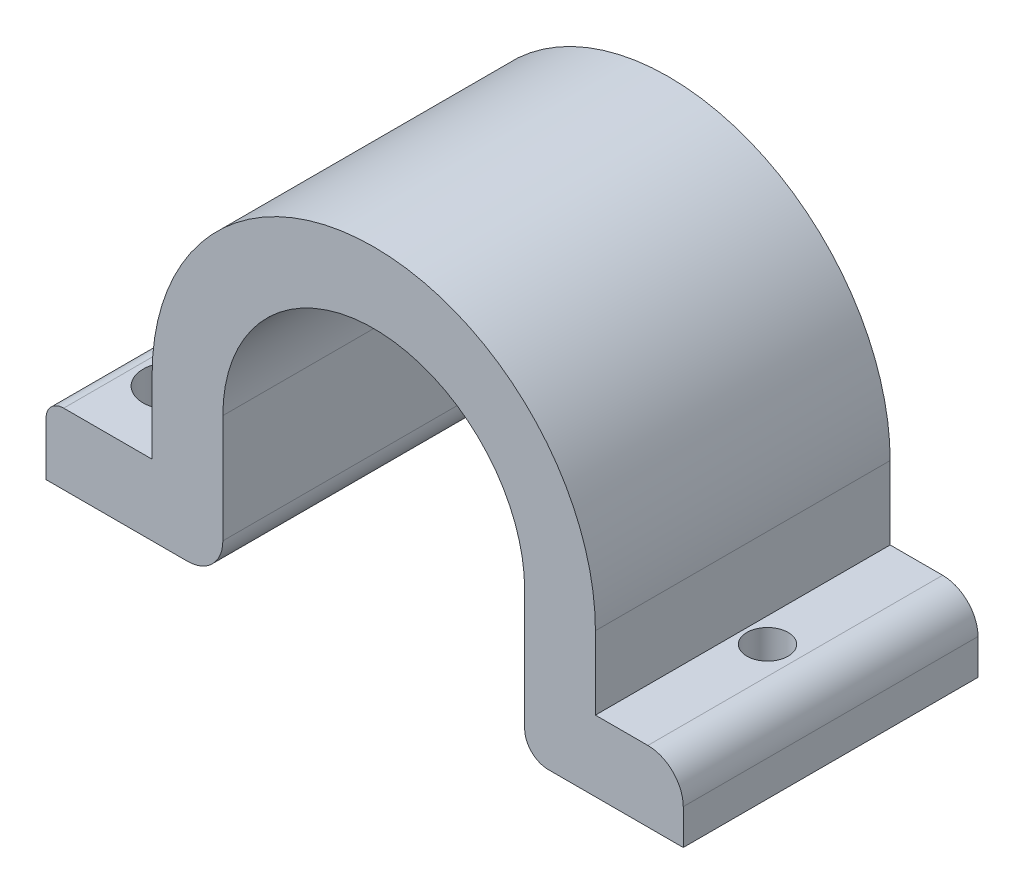
ISO-10303-21;
HEADER;
FILE_DESCRIPTION(('STEP AP214'),'2;1');
FILE_NAME('part.step','',(''),(''),'','','');
FILE_SCHEMA(('AUTOMOTIVE_DESIGN { 1 0 10303 214 1 1 1 1 }'));
ENDSEC;
DATA;
#1=APPLICATION_CONTEXT('core data for automotive mechanical design processes');
#2=APPLICATION_PROTOCOL_DEFINITION('international standard','automotive_design',2000,#1);
#3=PRODUCT_CONTEXT('',#1,'mechanical');
#4=PRODUCT('Part','Part','',(#3));
#5=PRODUCT_RELATED_PRODUCT_CATEGORY('part','',(#4));
#6=PRODUCT_DEFINITION_FORMATION('','',#4);
#7=PRODUCT_DEFINITION_CONTEXT('part definition',#1,'design');
#8=PRODUCT_DEFINITION('design','',#6,#7);
#9=PRODUCT_DEFINITION_SHAPE('','',#8);
#10=(LENGTH_UNIT() NAMED_UNIT(*) SI_UNIT(.MILLI.,.METRE.));
#11=(NAMED_UNIT(*) PLANE_ANGLE_UNIT() SI_UNIT($,.RADIAN.));
#12=(NAMED_UNIT(*) SI_UNIT($,.STERADIAN.) SOLID_ANGLE_UNIT());
#13=UNCERTAINTY_MEASURE_WITH_UNIT(LENGTH_MEASURE(1.E-05),#10,'distance_accuracy_value','');
#14=(GEOMETRIC_REPRESENTATION_CONTEXT(3) GLOBAL_UNCERTAINTY_ASSIGNED_CONTEXT((#13)) GLOBAL_UNIT_ASSIGNED_CONTEXT((#10,
#11,#12)) REPRESENTATION_CONTEXT('',''));
#15=CARTESIAN_POINT('',(0.,0.,0.));
#16=DIRECTION('',(0.,0.,1.));
#17=DIRECTION('',(1.,0.,0.));
#18=AXIS2_PLACEMENT_3D('',#15,#16,#17);
#19=CARTESIAN_POINT('',(0.397051683197472,57.076719781537,12.5));
#20=DIRECTION('',(0.,1.,0.));
#21=DIRECTION('',(-1.,0.,0.));
#22=AXIS2_PLACEMENT_3D('',#19,#20,#21);
#23=PLANE('',#22);
#24=DIRECTION('',(1.,0.,0.));
#25=VECTOR('',#24,1.);
#26=CARTESIAN_POINT('',(0.397051683197472,57.076719781537,-12.5));
#27=LINE('',#26,#25);
#28=CARTESIAN_POINT('',(-1.60294831680253,57.076719781537,-12.5));
#29=VERTEX_POINT('',#28);
#30=CARTESIAN_POINT('',(10.3970516831975,57.076719781537,-12.5));
#31=VERTEX_POINT('',#30);
#32=EDGE_CURVE('E165',#29,#31,#27,.T.);
#33=ORIENTED_EDGE('',*,*,#32,.T.);
#34=DIRECTION('',(0.,0.,-1.));
#35=VECTOR('',#34,1.);
#36=CARTESIAN_POINT('',(10.3970516831975,57.076719781537,12.5));
#37=LINE('',#36,#35);
#38=CARTESIAN_POINT('',(10.3970516831975,57.076719781537,12.5));
#39=VERTEX_POINT('',#38);
#40=EDGE_CURVE('E162',#39,#31,#37,.T.);
#41=ORIENTED_EDGE('',*,*,#40,.F.);
#42=DIRECTION('',(1.,0.,0.));
#43=VECTOR('',#42,1.);
#44=CARTESIAN_POINT('',(0.397051683197472,57.076719781537,12.5));
#45=LINE('',#44,#43);
#46=CARTESIAN_POINT('',(-1.60294831680253,57.076719781537,12.5));
#47=VERTEX_POINT('',#46);
#48=EDGE_CURVE('E148',#47,#39,#45,.T.);
#49=ORIENTED_EDGE('',*,*,#48,.F.);
#50=DIRECTION('',(0.,0.,-1.));
#51=VECTOR('',#50,1.);
#52=CARTESIAN_POINT('',(-1.60294831680253,57.076719781537,12.5));
#53=LINE('',#52,#51);
#54=EDGE_CURVE('E201',#47,#29,#53,.T.);
#55=ORIENTED_EDGE('',*,*,#54,.T.);
#56=EDGE_LOOP('',(#33,#41,#49,#55));
#57=FACE_BOUND('',#56,.T.);
#58=CARTESIAN_POINT('',(2.89705168319747,57.076719781537,6.25));
#59=DIRECTION('',(0.,1.,0.));
#60=DIRECTION('',(-1.,0.,0.));
#61=AXIS2_PLACEMENT_3D('',#58,#59,#60);
#62=CIRCLE('',#61,2.5);
#63=CARTESIAN_POINT('',(0.397051683197472,57.076719781537,6.25));
#64=VERTEX_POINT('',#63);
#65=EDGE_CURVE('E394',#64,#64,#62,.F.);
#66=ORIENTED_EDGE('',*,*,#65,.F.);
#67=EDGE_LOOP('',(#66));
#68=FACE_BOUND('',#67,.T.);
#69=CARTESIAN_POINT('',(2.89705168319747,57.076719781537,-6.25));
#70=DIRECTION('',(0.,1.,0.));
#71=DIRECTION('',(-1.,0.,0.));
#72=AXIS2_PLACEMENT_3D('',#69,#70,#71);
#73=CIRCLE('',#72,2.5);
#74=CARTESIAN_POINT('',(0.397051683197472,57.076719781537,-6.25));
#75=VERTEX_POINT('',#74);
#76=EDGE_CURVE('E392',#75,#75,#73,.T.);
#77=ORIENTED_EDGE('',*,*,#76,.T.);
#78=EDGE_LOOP('',(#77));
#79=FACE_BOUND('',#78,.T.);
#80=ADVANCED_FACE('F37',(#57,#68,#79),#23,.F.);
#81=CARTESIAN_POINT('',(0.397051683197472,63.076719781537,12.5));
#82=DIRECTION('',(0.,-1.,0.));
#83=DIRECTION('',(1.,0.,0.));
#84=AXIS2_PLACEMENT_3D('',#81,#82,#83);
#85=PLANE('',#84);
#86=DIRECTION('',(-1.,0.,0.));
#87=VECTOR('',#86,1.);
#88=CARTESIAN_POINT('',(0.397051683197472,63.076719781537,-12.5));
#89=LINE('',#88,#87);
#90=CARTESIAN_POINT('',(7.39705168319747,63.076719781537,-12.5));
#91=VERTEX_POINT('',#90);
#92=CARTESIAN_POINT('',(-0.102948316802517,63.076719781537,-12.5));
#93=VERTEX_POINT('',#92);
#94=EDGE_CURVE('E229',#91,#93,#89,.T.);
#95=ORIENTED_EDGE('',*,*,#94,.T.);
#96=DIRECTION('',(0.,0.,-1.));
#97=VECTOR('',#96,1.);
#98=CARTESIAN_POINT('',(-0.102948316802517,63.076719781537,12.5));
#99=LINE('',#98,#97);
#100=CARTESIAN_POINT('',(-0.102948316802517,63.076719781537,12.5));
#101=VERTEX_POINT('',#100);
#102=EDGE_CURVE('E45',#93,#101,#99,.F.);
#103=ORIENTED_EDGE('',*,*,#102,.T.);
#104=DIRECTION('',(-1.,0.,0.));
#105=VECTOR('',#104,1.);
#106=CARTESIAN_POINT('',(0.397051683197472,63.076719781537,12.5));
#107=LINE('',#106,#105);
#108=CARTESIAN_POINT('',(7.39705168319747,63.076719781537,12.5));
#109=VERTEX_POINT('',#108);
#110=EDGE_CURVE('E198',#109,#101,#107,.T.);
#111=ORIENTED_EDGE('',*,*,#110,.F.);
#112=DIRECTION('',(0.,0.,-1.));
#113=VECTOR('',#112,1.);
#114=CARTESIAN_POINT('',(7.39705168319747,63.076719781537,12.5));
#115=LINE('',#114,#113);
#116=EDGE_CURVE('E233',#109,#91,#115,.T.);
#117=ORIENTED_EDGE('',*,*,#116,.T.);
#118=EDGE_LOOP('',(#95,#103,#111,#117));
#119=FACE_BOUND('',#118,.T.);
#120=CARTESIAN_POINT('',(2.89705168319747,63.076719781537,6.25));
#121=DIRECTION('',(0.,-1.,0.));
#122=DIRECTION('',(0.,0.,-1.));
#123=AXIS2_PLACEMENT_3D('',#120,#121,#122);
#124=CIRCLE('',#123,2.5);
#125=CARTESIAN_POINT('',(2.89705168319747,63.076719781537,3.75));
#126=VERTEX_POINT('',#125);
#127=EDGE_CURVE('E403',#126,#126,#124,.T.);
#128=ORIENTED_EDGE('',*,*,#127,.T.);
#129=EDGE_LOOP('',(#128));
#130=FACE_BOUND('',#129,.T.);
#131=CARTESIAN_POINT('',(2.89705168319747,63.076719781537,-6.25));
#132=DIRECTION('',(0.,1.,0.));
#133=DIRECTION('',(0.,0.,1.));
#134=AXIS2_PLACEMENT_3D('',#131,#132,#133);
#135=CIRCLE('',#134,2.5);
#136=CARTESIAN_POINT('',(2.89705168319747,63.076719781537,-3.75));
#137=VERTEX_POINT('',#136);
#138=EDGE_CURVE('E389',#137,#137,#135,.T.);
#139=ORIENTED_EDGE('',*,*,#138,.F.);
#140=EDGE_LOOP('',(#139));
#141=FACE_BOUND('',#140,.T.);
#142=ADVANCED_FACE('F330',(#119,#130,#141),#85,.F.);
#143=CARTESIAN_POINT('',(10.3970516831975,60.076719781537,12.5));
#144=DIRECTION('',(0.,0.,-1.));
#145=DIRECTION('',(-1.,0.,0.));
#146=AXIS2_PLACEMENT_3D('',#143,#144,#145);
#147=CYLINDRICAL_SURFACE('',#146,3.00000000000001);
#148=CARTESIAN_POINT('',(10.3970516831975,60.076719781537,-12.5));
#149=DIRECTION('',(0.,0.,1.));
#150=DIRECTION('',(1.,0.,0.));
#151=AXIS2_PLACEMENT_3D('',#148,#149,#150);
#152=CIRCLE('',#151,3.00000000000001);
#153=CARTESIAN_POINT('',(13.3970516831975,60.076719781537,-12.5));
#154=VERTEX_POINT('',#153);
#155=EDGE_CURVE('E203',#31,#154,#152,.T.);
#156=ORIENTED_EDGE('',*,*,#155,.T.);
#157=DIRECTION('',(0.,0.,-1.));
#158=VECTOR('',#157,1.);
#159=CARTESIAN_POINT('',(13.3970516831975,60.076719781537,12.5));
#160=LINE('',#159,#158);
#161=CARTESIAN_POINT('',(13.3970516831975,60.076719781537,12.5));
#162=VERTEX_POINT('',#161);
#163=EDGE_CURVE('E169',#162,#154,#160,.T.);
#164=ORIENTED_EDGE('',*,*,#163,.F.);
#165=CARTESIAN_POINT('',(10.3970516831975,60.076719781537,12.5));
#166=DIRECTION('',(0.,0.,1.));
#167=DIRECTION('',(1.,0.,0.));
#168=AXIS2_PLACEMENT_3D('',#165,#166,#167);
#169=CIRCLE('',#168,3.00000000000001);
#170=EDGE_CURVE('E152',#39,#162,#169,.T.);
#171=ORIENTED_EDGE('',*,*,#170,.F.);
#172=ORIENTED_EDGE('',*,*,#40,.T.);
#173=EDGE_LOOP('',(#156,#164,#171,#172));
#174=FACE_BOUND('',#173,.T.);
#175=ADVANCED_FACE('F171',(#174),#147,.T.);
#176=CARTESIAN_POINT('',(13.3970516831975,60.076719781537,12.5));
#177=DIRECTION('',(-1.,0.,0.));
#178=DIRECTION('',(0.,0.,1.));
#179=AXIS2_PLACEMENT_3D('',#176,#177,#178);
#180=PLANE('',#179);
#181=DIRECTION('',(0.,1.,0.));
#182=VECTOR('',#181,1.);
#183=CARTESIAN_POINT('',(13.3970516831975,60.076719781537,-12.5));
#184=LINE('',#183,#182);
#185=CARTESIAN_POINT('',(13.3970516831975,69.276719781537,-12.5));
#186=VERTEX_POINT('',#185);
#187=EDGE_CURVE('E206',#154,#186,#184,.T.);
#188=ORIENTED_EDGE('',*,*,#187,.T.);
#189=DIRECTION('',(0.,0.,-1.));
#190=VECTOR('',#189,1.);
#191=CARTESIAN_POINT('',(13.3970516831975,69.276719781537,12.5));
#192=LINE('',#191,#190);
#193=CARTESIAN_POINT('',(13.3970516831975,69.276719781537,12.5));
#194=VERTEX_POINT('',#193);
#195=EDGE_CURVE('E257',#194,#186,#192,.T.);
#196=ORIENTED_EDGE('',*,*,#195,.F.);
#197=DIRECTION('',(0.,1.,0.));
#198=VECTOR('',#197,1.);
#199=CARTESIAN_POINT('',(13.3970516831975,60.076719781537,12.5));
#200=LINE('',#199,#198);
#201=EDGE_CURVE('E174',#162,#194,#200,.T.);
#202=ORIENTED_EDGE('',*,*,#201,.F.);
#203=ORIENTED_EDGE('',*,*,#163,.T.);
#204=EDGE_LOOP('',(#188,#196,#202,#203));
#205=FACE_BOUND('',#204,.T.);
#206=ADVANCED_FACE('F281',(#205),#180,.F.);
#207=CARTESIAN_POINT('',(26.1970516831975,69.276719781537,12.5));
#208=DIRECTION('',(0.,0.,-1.));
#209=DIRECTION('',(-1.,0.,0.));
#210=AXIS2_PLACEMENT_3D('',#207,#208,#209);
#211=CYLINDRICAL_SURFACE('',#210,12.8);
#212=CARTESIAN_POINT('',(26.1970516831975,69.276719781537,-12.5));
#213=DIRECTION('',(0.,0.,-1.));
#214=DIRECTION('',(-1.,0.,0.));
#215=AXIS2_PLACEMENT_3D('',#212,#213,#214);
#216=CIRCLE('',#215,12.8);
#217=CARTESIAN_POINT('',(38.9970516831975,69.276719781537,-12.5));
#218=VERTEX_POINT('',#217);
#219=EDGE_CURVE('E208',#186,#218,#216,.T.);
#220=ORIENTED_EDGE('',*,*,#219,.T.);
#221=DIRECTION('',(0.,0.,-1.));
#222=VECTOR('',#221,1.);
#223=CARTESIAN_POINT('',(38.9970516831975,69.276719781537,12.5));
#224=LINE('',#223,#222);
#225=CARTESIAN_POINT('',(38.9970516831975,69.276719781537,12.5));
#226=VERTEX_POINT('',#225);
#227=EDGE_CURVE('E254',#226,#218,#224,.T.);
#228=ORIENTED_EDGE('',*,*,#227,.F.);
#229=CARTESIAN_POINT('',(26.1970516831975,69.276719781537,12.5));
#230=DIRECTION('',(0.,0.,-1.));
#231=DIRECTION('',(-1.,0.,0.));
#232=AXIS2_PLACEMENT_3D('',#229,#230,#231);
#233=CIRCLE('',#232,12.8);
#234=EDGE_CURVE('E176',#194,#226,#233,.T.);
#235=ORIENTED_EDGE('',*,*,#234,.F.);
#236=ORIENTED_EDGE('',*,*,#195,.T.);
#237=EDGE_LOOP('',(#220,#228,#235,#236));
#238=FACE_BOUND('',#237,.T.);
#239=ADVANCED_FACE('F288',(#238),#211,.F.);
#240=CARTESIAN_POINT('',(38.9970516831975,69.276719781537,12.5));
#241=DIRECTION('',(1.,0.,0.));
#242=DIRECTION('',(0.,1.,0.));
#243=AXIS2_PLACEMENT_3D('',#240,#241,#242);
#244=PLANE('',#243);
#245=DIRECTION('',(0.,-1.,0.));
#246=VECTOR('',#245,1.);
#247=CARTESIAN_POINT('',(38.9970516831975,69.276719781537,-12.5));
#248=LINE('',#247,#246);
#249=CARTESIAN_POINT('',(38.9970516831975,59.076719781537,-12.5));
#250=VERTEX_POINT('',#249);
#251=EDGE_CURVE('E210',#218,#250,#248,.T.);
#252=ORIENTED_EDGE('',*,*,#251,.T.);
#253=DIRECTION('',(0.,0.,-1.));
#254=VECTOR('',#253,1.);
#255=CARTESIAN_POINT('',(38.9970516831975,59.076719781537,12.5));
#256=LINE('',#255,#254);
#257=CARTESIAN_POINT('',(38.9970516831975,59.076719781537,12.5));
#258=VERTEX_POINT('',#257);
#259=EDGE_CURVE('E251',#258,#250,#256,.T.);
#260=ORIENTED_EDGE('',*,*,#259,.F.);
#261=DIRECTION('',(0.,-1.,0.));
#262=VECTOR('',#261,1.);
#263=CARTESIAN_POINT('',(38.9970516831975,69.276719781537,12.5));
#264=LINE('',#263,#262);
#265=EDGE_CURVE('E181',#226,#258,#264,.T.);
#266=ORIENTED_EDGE('',*,*,#265,.F.);
#267=ORIENTED_EDGE('',*,*,#227,.T.);
#268=EDGE_LOOP('',(#252,#260,#266,#267));
#269=FACE_BOUND('',#268,.T.);
#270=ADVANCED_FACE('F291',(#269),#244,.F.);
#271=CARTESIAN_POINT('',(40.9970516831975,59.076719781537,12.5));
#272=DIRECTION('',(0.,0.,-1.));
#273=DIRECTION('',(-1.,0.,0.));
#274=AXIS2_PLACEMENT_3D('',#271,#272,#273);
#275=CYLINDRICAL_SURFACE('',#274,1.99999999999999);
#276=CARTESIAN_POINT('',(40.9970516831975,59.076719781537,-12.5));
#277=DIRECTION('',(0.,0.,1.));
#278=DIRECTION('',(1.,0.,0.));
#279=AXIS2_PLACEMENT_3D('',#276,#277,#278);
#280=CIRCLE('',#279,1.99999999999999);
#281=CARTESIAN_POINT('',(40.9970516831975,57.076719781537,-12.5));
#282=VERTEX_POINT('',#281);
#283=EDGE_CURVE('E212',#250,#282,#280,.T.);
#284=ORIENTED_EDGE('',*,*,#283,.T.);
#285=DIRECTION('',(0.,0.,-1.));
#286=VECTOR('',#285,1.);
#287=CARTESIAN_POINT('',(40.9970516831975,57.076719781537,12.5));
#288=LINE('',#287,#286);
#289=CARTESIAN_POINT('',(40.9970516831975,57.076719781537,12.5));
#290=VERTEX_POINT('',#289);
#291=EDGE_CURVE('E248',#290,#282,#288,.T.);
#292=ORIENTED_EDGE('',*,*,#291,.F.);
#293=CARTESIAN_POINT('',(40.9970516831975,59.076719781537,12.5));
#294=DIRECTION('',(0.,0.,1.));
#295=DIRECTION('',(1.,0.,0.));
#296=AXIS2_PLACEMENT_3D('',#293,#294,#295);
#297=CIRCLE('',#296,1.99999999999999);
#298=EDGE_CURVE('E183',#258,#290,#297,.T.);
#299=ORIENTED_EDGE('',*,*,#298,.F.);
#300=ORIENTED_EDGE('',*,*,#259,.T.);
#301=EDGE_LOOP('',(#284,#292,#299,#300));
#302=FACE_BOUND('',#301,.T.);
#303=ADVANCED_FACE('F296',(#302),#275,.T.);
#304=CARTESIAN_POINT('',(49.4205529094609,57.076719781537,12.5));
#305=DIRECTION('',(0.,1.,0.));
#306=DIRECTION('',(0.,0.,1.));
#307=AXIS2_PLACEMENT_3D('',#304,#305,#306);
#308=PLANE('',#307);
#309=CARTESIAN_POINT('',(47.0933932000514,57.076719781537,0.));
#310=DIRECTION('',(0.,1.,0.));
#311=DIRECTION('',(0.,0.,1.));
#312=AXIS2_PLACEMENT_3D('',#309,#310,#311);
#313=CIRCLE('',#312,1.75);
#314=CARTESIAN_POINT('',(47.0933932000514,57.076719781537,1.75));
#315=VERTEX_POINT('',#314);
#316=EDGE_CURVE('E204',#315,#315,#313,.T.);
#317=ORIENTED_EDGE('',*,*,#316,.T.);
#318=EDGE_LOOP('',(#317));
#319=FACE_BOUND('',#318,.T.);
#320=DIRECTION('',(1.,0.,0.));
#321=VECTOR('',#320,1.);
#322=CARTESIAN_POINT('',(49.4205529094609,57.076719781537,-12.5));
#323=LINE('',#322,#321);
#324=CARTESIAN_POINT('',(52.447260314276,57.076719781537,-12.5));
#325=VERTEX_POINT('',#324);
#326=EDGE_CURVE('E215',#282,#325,#323,.T.);
#327=ORIENTED_EDGE('',*,*,#326,.T.);
#328=DIRECTION('',(0.,0.,-1.));
#329=VECTOR('',#328,1.);
#330=CARTESIAN_POINT('',(52.447260314276,57.076719781537,12.5));
#331=LINE('',#330,#329);
#332=CARTESIAN_POINT('',(52.447260314276,57.076719781537,12.5));
#333=VERTEX_POINT('',#332);
#334=EDGE_CURVE('E245',#333,#325,#331,.T.);
#335=ORIENTED_EDGE('',*,*,#334,.F.);
#336=DIRECTION('',(1.,0.,0.));
#337=VECTOR('',#336,1.);
#338=CARTESIAN_POINT('',(40.9970516831975,57.076719781537,12.5));
#339=LINE('',#338,#337);
#340=EDGE_CURVE('E185',#290,#333,#339,.T.);
#341=ORIENTED_EDGE('',*,*,#340,.F.);
#342=ORIENTED_EDGE('',*,*,#291,.T.);
#343=EDGE_LOOP('',(#327,#335,#341,#342));
#344=FACE_BOUND('',#343,.T.);
#345=ADVANCED_FACE('F302',(#319,#344),#308,.F.);
#346=CARTESIAN_POINT('',(52.447260314276,57.076719781537,12.5));
#347=DIRECTION('',(-1.,0.,0.));
#348=DIRECTION('',(0.,0.,1.));
#349=AXIS2_PLACEMENT_3D('',#346,#347,#348);
#350=PLANE('',#349);
#351=DIRECTION('',(0.,1.,0.));
#352=VECTOR('',#351,1.);
#353=CARTESIAN_POINT('',(52.447260314276,57.076719781537,-12.5));
#354=LINE('',#353,#352);
#355=CARTESIAN_POINT('',(52.447260314276,60.076719781537,-12.5));
#356=VERTEX_POINT('',#355);
#357=EDGE_CURVE('E217',#325,#356,#354,.T.);
#358=ORIENTED_EDGE('',*,*,#357,.T.);
#359=DIRECTION('',(0.,0.,-1.));
#360=VECTOR('',#359,1.);
#361=CARTESIAN_POINT('',(52.447260314276,60.076719781537,12.5));
#362=LINE('',#361,#360);
#363=CARTESIAN_POINT('',(52.447260314276,60.076719781537,12.5));
#364=VERTEX_POINT('',#363);
#365=EDGE_CURVE('E265',#356,#364,#362,.F.);
#366=ORIENTED_EDGE('',*,*,#365,.T.);
#367=DIRECTION('',(0.,1.,0.));
#368=VECTOR('',#367,1.);
#369=CARTESIAN_POINT('',(52.447260314276,57.076719781537,12.5));
#370=LINE('',#369,#368);
#371=EDGE_CURVE('E187',#333,#364,#370,.T.);
#372=ORIENTED_EDGE('',*,*,#371,.F.);
#373=ORIENTED_EDGE('',*,*,#334,.T.);
#374=EDGE_LOOP('',(#358,#366,#372,#373));
#375=FACE_BOUND('',#374,.T.);
#376=ADVANCED_FACE('F305',(#375),#350,.F.);
#377=CARTESIAN_POINT('',(44.9970516831975,63.076719781537,12.5));
#378=DIRECTION('',(0.,-1.,0.));
#379=DIRECTION('',(0.,0.,-1.));
#380=AXIS2_PLACEMENT_3D('',#377,#378,#379);
#381=PLANE('',#380);
#382=CARTESIAN_POINT('',(47.0933932000514,63.076719781537,0.));
#383=DIRECTION('',(0.,1.,0.));
#384=DIRECTION('',(0.,0.,1.));
#385=AXIS2_PLACEMENT_3D('',#382,#383,#384);
#386=CIRCLE('',#385,1.75);
#387=CARTESIAN_POINT('',(47.0933932000514,63.076719781537,1.75));
#388=VERTEX_POINT('',#387);
#389=EDGE_CURVE('E400',#388,#388,#386,.T.);
#390=ORIENTED_EDGE('',*,*,#389,.F.);
#391=EDGE_LOOP('',(#390));
#392=FACE_BOUND('',#391,.T.);
#393=DIRECTION('',(-1.,0.,0.));
#394=VECTOR('',#393,1.);
#395=CARTESIAN_POINT('',(52.447260314276,63.076719781537,12.5));
#396=LINE('',#395,#394);
#397=CARTESIAN_POINT('',(49.447260314276,63.076719781537,12.5));
#398=VERTEX_POINT('',#397);
#399=CARTESIAN_POINT('',(44.9970516831975,63.076719781537,12.5));
#400=VERTEX_POINT('',#399);
#401=EDGE_CURVE('E190',#398,#400,#396,.T.);
#402=ORIENTED_EDGE('',*,*,#401,.F.);
#403=DIRECTION('',(0.,0.,-1.));
#404=VECTOR('',#403,1.);
#405=CARTESIAN_POINT('',(49.447260314276,63.076719781537,12.5));
#406=LINE('',#405,#404);
#407=CARTESIAN_POINT('',(49.447260314276,63.076719781537,-12.5));
#408=VERTEX_POINT('',#407);
#409=EDGE_CURVE('E168',#398,#408,#406,.T.);
#410=ORIENTED_EDGE('',*,*,#409,.T.);
#411=DIRECTION('',(-1.,0.,0.));
#412=VECTOR('',#411,1.);
#413=CARTESIAN_POINT('',(44.9970516831975,63.076719781537,-12.5));
#414=LINE('',#413,#412);
#415=CARTESIAN_POINT('',(44.9970516831975,63.076719781537,-12.5));
#416=VERTEX_POINT('',#415);
#417=EDGE_CURVE('E220',#408,#416,#414,.T.);
#418=ORIENTED_EDGE('',*,*,#417,.T.);
#419=DIRECTION('',(0.,0.,-1.));
#420=VECTOR('',#419,1.);
#421=CARTESIAN_POINT('',(44.9970516831975,63.076719781537,12.5));
#422=LINE('',#421,#420);
#423=EDGE_CURVE('E242',#400,#416,#422,.T.);
#424=ORIENTED_EDGE('',*,*,#423,.F.);
#425=EDGE_LOOP('',(#402,#410,#418,#424));
#426=FACE_BOUND('',#425,.T.);
#427=ADVANCED_FACE('F313',(#392,#426),#381,.F.);
#428=CARTESIAN_POINT('',(44.9970516831975,69.276719781537,12.5));
#429=DIRECTION('',(-1.,0.,0.));
#430=DIRECTION('',(0.,0.,1.));
#431=AXIS2_PLACEMENT_3D('',#428,#429,#430);
#432=PLANE('',#431);
#433=DIRECTION('',(0.,1.,0.));
#434=VECTOR('',#433,1.);
#435=CARTESIAN_POINT('',(44.9970516831975,69.276719781537,-12.5));
#436=LINE('',#435,#434);
#437=CARTESIAN_POINT('',(44.9970516831975,69.276719781537,-12.5));
#438=VERTEX_POINT('',#437);
#439=EDGE_CURVE('E222',#416,#438,#436,.T.);
#440=ORIENTED_EDGE('',*,*,#439,.T.);
#441=DIRECTION('',(0.,0.,-1.));
#442=VECTOR('',#441,1.);
#443=CARTESIAN_POINT('',(44.9970516831975,69.276719781537,12.5));
#444=LINE('',#443,#442);
#445=CARTESIAN_POINT('',(44.9970516831975,69.276719781537,12.5));
#446=VERTEX_POINT('',#445);
#447=EDGE_CURVE('E239',#446,#438,#444,.T.);
#448=ORIENTED_EDGE('',*,*,#447,.F.);
#449=DIRECTION('',(0.,1.,0.));
#450=VECTOR('',#449,1.);
#451=CARTESIAN_POINT('',(44.9970516831975,69.276719781537,12.5));
#452=LINE('',#451,#450);
#453=EDGE_CURVE('E192',#400,#446,#452,.T.);
#454=ORIENTED_EDGE('',*,*,#453,.F.);
#455=ORIENTED_EDGE('',*,*,#423,.T.);
#456=EDGE_LOOP('',(#440,#448,#454,#455));
#457=FACE_BOUND('',#456,.T.);
#458=ADVANCED_FACE('F319',(#457),#432,.F.);
#459=CARTESIAN_POINT('',(26.1970516831975,69.276719781537,12.5));
#460=DIRECTION('',(0.,0.,-1.));
#461=DIRECTION('',(-1.,0.,0.));
#462=AXIS2_PLACEMENT_3D('',#459,#460,#461);
#463=CYLINDRICAL_SURFACE('',#462,18.8);
#464=CARTESIAN_POINT('',(26.1970516831975,69.276719781537,-12.5));
#465=DIRECTION('',(0.,0.,1.));
#466=DIRECTION('',(-1.,0.,0.));
#467=AXIS2_PLACEMENT_3D('',#464,#465,#466);
#468=CIRCLE('',#467,18.8);
#469=CARTESIAN_POINT('',(7.39705168319747,69.276719781537,-12.5));
#470=VERTEX_POINT('',#469);
#471=EDGE_CURVE('E224',#438,#470,#468,.T.);
#472=ORIENTED_EDGE('',*,*,#471,.T.);
#473=DIRECTION('',(0.,0.,-1.));
#474=VECTOR('',#473,1.);
#475=CARTESIAN_POINT('',(7.39705168319747,69.276719781537,12.5));
#476=LINE('',#475,#474);
#477=CARTESIAN_POINT('',(7.39705168319747,69.276719781537,12.5));
#478=VERTEX_POINT('',#477);
#479=EDGE_CURVE('E236',#478,#470,#476,.T.);
#480=ORIENTED_EDGE('',*,*,#479,.F.);
#481=CARTESIAN_POINT('',(26.1970516831975,69.276719781537,12.5));
#482=DIRECTION('',(0.,0.,1.));
#483=DIRECTION('',(-1.,0.,0.));
#484=AXIS2_PLACEMENT_3D('',#481,#482,#483);
#485=CIRCLE('',#484,18.8);
#486=EDGE_CURVE('E194',#446,#478,#485,.T.);
#487=ORIENTED_EDGE('',*,*,#486,.F.);
#488=ORIENTED_EDGE('',*,*,#447,.T.);
#489=EDGE_LOOP('',(#472,#480,#487,#488));
#490=FACE_BOUND('',#489,.T.);
#491=ADVANCED_FACE('F325',(#490),#463,.T.);
#492=CARTESIAN_POINT('',(7.39705168319747,63.076719781537,12.5));
#493=DIRECTION('',(1.,0.,0.));
#494=DIRECTION('',(0.,0.,-1.));
#495=AXIS2_PLACEMENT_3D('',#492,#493,#494);
#496=PLANE('',#495);
#497=DIRECTION('',(0.,-1.,0.));
#498=VECTOR('',#497,1.);
#499=CARTESIAN_POINT('',(7.39705168319747,63.076719781537,-12.5));
#500=LINE('',#499,#498);
#501=EDGE_CURVE('E226',#470,#91,#500,.T.);
#502=ORIENTED_EDGE('',*,*,#501,.T.);
#503=ORIENTED_EDGE('',*,*,#116,.F.);
#504=DIRECTION('',(0.,-1.,0.));
#505=VECTOR('',#504,1.);
#506=CARTESIAN_POINT('',(7.39705168319747,63.076719781537,12.5));
#507=LINE('',#506,#505);
#508=EDGE_CURVE('E196',#478,#109,#507,.T.);
#509=ORIENTED_EDGE('',*,*,#508,.F.);
#510=ORIENTED_EDGE('',*,*,#479,.T.);
#511=EDGE_LOOP('',(#502,#503,#509,#510));
#512=FACE_BOUND('',#511,.T.);
#513=ADVANCED_FACE('F329',(#512),#496,.F.);
#514=CARTESIAN_POINT('',(-1.60294831680253,57.076719781537,12.5));
#515=DIRECTION('',(1.,0.,0.));
#516=DIRECTION('',(0.,1.,0.));
#517=AXIS2_PLACEMENT_3D('',#514,#515,#516);
#518=PLANE('',#517);
#519=DIRECTION('',(0.,-1.,0.));
#520=VECTOR('',#519,1.);
#521=CARTESIAN_POINT('',(-1.60294831680253,57.076719781537,12.5));
#522=LINE('',#521,#520);
#523=CARTESIAN_POINT('',(-1.60294831680253,61.576719781537,12.5));
#524=VERTEX_POINT('',#523);
#525=EDGE_CURVE('E155',#524,#47,#522,.T.);
#526=ORIENTED_EDGE('',*,*,#525,.F.);
#527=DIRECTION('',(0.,0.,-1.));
#528=VECTOR('',#527,1.);
#529=CARTESIAN_POINT('',(-1.60294831680253,61.576719781537,12.5));
#530=LINE('',#529,#528);
#531=CARTESIAN_POINT('',(-1.60294831680253,61.576719781537,-12.5));
#532=VERTEX_POINT('',#531);
#533=EDGE_CURVE('E269',#524,#532,#530,.T.);
#534=ORIENTED_EDGE('',*,*,#533,.T.);
#535=DIRECTION('',(0.,-1.,0.));
#536=VECTOR('',#535,1.);
#537=CARTESIAN_POINT('',(-1.60294831680253,57.076719781537,-12.5));
#538=LINE('',#537,#536);
#539=EDGE_CURVE('E159',#532,#29,#538,.T.);
#540=ORIENTED_EDGE('',*,*,#539,.T.);
#541=ORIENTED_EDGE('',*,*,#54,.F.);
#542=EDGE_LOOP('',(#526,#534,#540,#541));
#543=FACE_BOUND('',#542,.T.);
#544=ADVANCED_FACE('F274',(#543),#518,.F.);
#545=CARTESIAN_POINT('',(26.1970516831975,69.276719781537,12.5));
#546=DIRECTION('',(0.,0.,-1.));
#547=DIRECTION('',(-1.,0.,0.));
#548=AXIS2_PLACEMENT_3D('',#545,#546,#547);
#549=PLANE('',#548);
#550=ORIENTED_EDGE('',*,*,#110,.T.);
#551=CARTESIAN_POINT('',(-0.102948316802527,61.576719781537,12.5));
#552=DIRECTION('',(0.,0.,-1.));
#553=DIRECTION('',(-1.,0.,0.));
#554=AXIS2_PLACEMENT_3D('',#551,#552,#553);
#555=CIRCLE('',#554,1.5);
#556=EDGE_CURVE('E11',#101,#524,#555,.F.);
#557=ORIENTED_EDGE('',*,*,#556,.T.);
#558=ORIENTED_EDGE('',*,*,#525,.T.);
#559=ORIENTED_EDGE('',*,*,#48,.T.);
#560=ORIENTED_EDGE('',*,*,#170,.T.);
#561=ORIENTED_EDGE('',*,*,#201,.T.);
#562=ORIENTED_EDGE('',*,*,#234,.T.);
#563=ORIENTED_EDGE('',*,*,#265,.T.);
#564=ORIENTED_EDGE('',*,*,#298,.T.);
#565=ORIENTED_EDGE('',*,*,#340,.T.);
#566=ORIENTED_EDGE('',*,*,#371,.T.);
#567=CARTESIAN_POINT('',(49.447260314276,60.076719781537,12.5));
#568=DIRECTION('',(0.,0.,-1.));
#569=DIRECTION('',(-1.,0.,0.));
#570=AXIS2_PLACEMENT_3D('',#567,#568,#569);
#571=CIRCLE('',#570,3.);
#572=EDGE_CURVE('E267',#364,#398,#571,.F.);
#573=ORIENTED_EDGE('',*,*,#572,.T.);
#574=ORIENTED_EDGE('',*,*,#401,.T.);
#575=ORIENTED_EDGE('',*,*,#453,.T.);
#576=ORIENTED_EDGE('',*,*,#486,.T.);
#577=ORIENTED_EDGE('',*,*,#508,.T.);
#578=EDGE_LOOP('',(#550,#557,#558,#559,#560,#561,#562,#563,#564,#565,#566,#573,#574,#575,#576,#577));
#579=FACE_BOUND('',#578,.T.);
#580=ADVANCED_FACE('F150',(#579),#549,.F.);
#581=CARTESIAN_POINT('',(26.1970516831975,69.276719781537,-12.5));
#582=DIRECTION('',(0.,0.,-1.));
#583=DIRECTION('',(-1.,0.,0.));
#584=AXIS2_PLACEMENT_3D('',#581,#582,#583);
#585=PLANE('',#584);
#586=ORIENTED_EDGE('',*,*,#539,.F.);
#587=CARTESIAN_POINT('',(-0.102948316802527,61.576719781537,-12.5));
#588=DIRECTION('',(0.,0.,-1.));
#589=DIRECTION('',(-1.,0.,0.));
#590=AXIS2_PLACEMENT_3D('',#587,#588,#589);
#591=CIRCLE('',#590,1.5);
#592=EDGE_CURVE('E59',#532,#93,#591,.T.);
#593=ORIENTED_EDGE('',*,*,#592,.T.);
#594=ORIENTED_EDGE('',*,*,#94,.F.);
#595=ORIENTED_EDGE('',*,*,#501,.F.);
#596=ORIENTED_EDGE('',*,*,#471,.F.);
#597=ORIENTED_EDGE('',*,*,#439,.F.);
#598=ORIENTED_EDGE('',*,*,#417,.F.);
#599=CARTESIAN_POINT('',(49.447260314276,60.076719781537,-12.5));
#600=DIRECTION('',(0.,0.,-1.));
#601=DIRECTION('',(-1.,0.,0.));
#602=AXIS2_PLACEMENT_3D('',#599,#600,#601);
#603=CIRCLE('',#602,3.);
#604=EDGE_CURVE('E263',#408,#356,#603,.T.);
#605=ORIENTED_EDGE('',*,*,#604,.T.);
#606=ORIENTED_EDGE('',*,*,#357,.F.);
#607=ORIENTED_EDGE('',*,*,#326,.F.);
#608=ORIENTED_EDGE('',*,*,#283,.F.);
#609=ORIENTED_EDGE('',*,*,#251,.F.);
#610=ORIENTED_EDGE('',*,*,#219,.F.);
#611=ORIENTED_EDGE('',*,*,#187,.F.);
#612=ORIENTED_EDGE('',*,*,#155,.F.);
#613=ORIENTED_EDGE('',*,*,#32,.F.);
#614=EDGE_LOOP('',(#586,#593,#594,#595,#596,#597,#598,#605,#606,#607,#608,#609,#610,#611,#612,#613));
#615=FACE_BOUND('',#614,.T.);
#616=ADVANCED_FACE('F277',(#615),#585,.T.);
#617=CARTESIAN_POINT('',(2.89705168319747,53.076719781537,6.25));
#618=DIRECTION('',(0.,1.,0.));
#619=DIRECTION('',(0.,0.,1.));
#620=AXIS2_PLACEMENT_3D('',#617,#618,#619);
#621=CYLINDRICAL_SURFACE('',#620,2.5);
#622=ORIENTED_EDGE('',*,*,#127,.F.);
#623=EDGE_LOOP('',(#622));
#624=FACE_BOUND('',#623,.T.);
#625=ORIENTED_EDGE('',*,*,#65,.T.);
#626=EDGE_LOOP('',(#625));
#627=FACE_BOUND('',#626,.T.);
#628=ADVANCED_FACE('F372',(#624,#627),#621,.F.);
#629=CARTESIAN_POINT('',(2.89705168319747,53.076719781537,-6.25));
#630=DIRECTION('',(0.,1.,0.));
#631=DIRECTION('',(0.,0.,1.));
#632=AXIS2_PLACEMENT_3D('',#629,#630,#631);
#633=CYLINDRICAL_SURFACE('',#632,2.5);
#634=ORIENTED_EDGE('',*,*,#138,.T.);
#635=EDGE_LOOP('',(#634));
#636=FACE_BOUND('',#635,.T.);
#637=ORIENTED_EDGE('',*,*,#76,.F.);
#638=EDGE_LOOP('',(#637));
#639=FACE_BOUND('',#638,.T.);
#640=ADVANCED_FACE('F377',(#636,#639),#633,.F.);
#641=CARTESIAN_POINT('',(47.0933932000514,53.076719781537,0.));
#642=DIRECTION('',(0.,1.,0.));
#643=DIRECTION('',(0.,0.,1.));
#644=AXIS2_PLACEMENT_3D('',#641,#642,#643);
#645=CYLINDRICAL_SURFACE('',#644,1.75);
#646=ORIENTED_EDGE('',*,*,#389,.T.);
#647=EDGE_LOOP('',(#646));
#648=FACE_BOUND('',#647,.T.);
#649=ORIENTED_EDGE('',*,*,#316,.F.);
#650=EDGE_LOOP('',(#649));
#651=FACE_BOUND('',#650,.T.);
#652=ADVANCED_FACE('F336',(#648,#651),#645,.F.);
#653=CARTESIAN_POINT('',(49.447260314276,60.076719781537,12.5));
#654=DIRECTION('',(0.,0.,-1.));
#655=DIRECTION('',(-1.,0.,0.));
#656=AXIS2_PLACEMENT_3D('',#653,#654,#655);
#657=CYLINDRICAL_SURFACE('',#656,3.);
#658=ORIENTED_EDGE('',*,*,#572,.F.);
#659=ORIENTED_EDGE('',*,*,#365,.F.);
#660=ORIENTED_EDGE('',*,*,#604,.F.);
#661=ORIENTED_EDGE('',*,*,#409,.F.);
#662=EDGE_LOOP('',(#658,#659,#660,#661));
#663=FACE_BOUND('',#662,.T.);
#664=ADVANCED_FACE('F308',(#663),#657,.T.);
#665=CARTESIAN_POINT('',(-0.102948316802527,61.576719781537,12.5));
#666=DIRECTION('',(0.,0.,-1.));
#667=DIRECTION('',(-1.,0.,0.));
#668=AXIS2_PLACEMENT_3D('',#665,#666,#667);
#669=CYLINDRICAL_SURFACE('',#668,1.5);
#670=ORIENTED_EDGE('',*,*,#556,.F.);
#671=ORIENTED_EDGE('',*,*,#102,.F.);
#672=ORIENTED_EDGE('',*,*,#592,.F.);
#673=ORIENTED_EDGE('',*,*,#533,.F.);
#674=EDGE_LOOP('',(#670,#671,#672,#673));
#675=FACE_BOUND('',#674,.T.);
#676=ADVANCED_FACE('F39',(#675),#669,.T.);
#677=CLOSED_SHELL('',(#80,#142,#175,#206,#239,#270,#303,#345,#376,#427,#458,#491,#513,#544,#580,
#616,#628,#640,#652,#664,#676));
#678=MANIFOLD_SOLID_BREP('B2',#677);
#679=ADVANCED_BREP_SHAPE_REPRESENTATION('',(#18,#678),#14);
#680=SHAPE_DEFINITION_REPRESENTATION(#9,#679);
ENDSEC;
END-ISO-10303-21;
